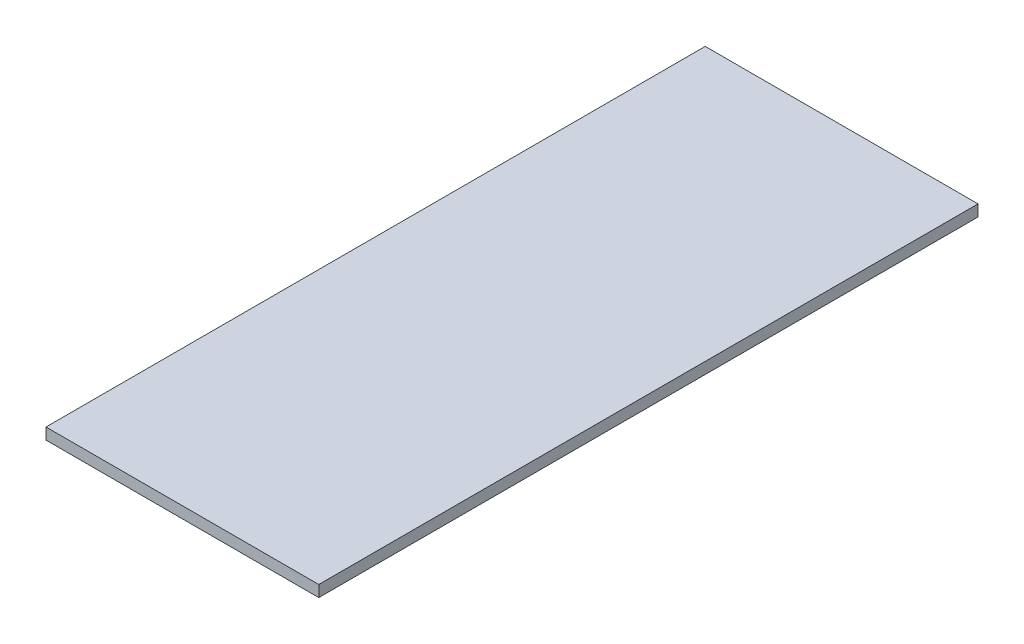
ISO-10303-21;
HEADER;
FILE_DESCRIPTION(('STEP AP214'),'2;1');
FILE_NAME('part.step','',(''),(''),'','','');
FILE_SCHEMA(('AUTOMOTIVE_DESIGN { 1 0 10303 214 1 1 1 1 }'));
ENDSEC;
DATA;
#1=APPLICATION_CONTEXT('core data for automotive mechanical design processes');
#2=APPLICATION_PROTOCOL_DEFINITION('international standard','automotive_design',2000,#1);
#3=PRODUCT_CONTEXT('',#1,'mechanical');
#4=PRODUCT('Part','Part','',(#3));
#5=PRODUCT_RELATED_PRODUCT_CATEGORY('part','',(#4));
#6=PRODUCT_DEFINITION_FORMATION('','',#4);
#7=PRODUCT_DEFINITION_CONTEXT('part definition',#1,'design');
#8=PRODUCT_DEFINITION('design','',#6,#7);
#9=PRODUCT_DEFINITION_SHAPE('','',#8);
#10=(LENGTH_UNIT() NAMED_UNIT(*) SI_UNIT(.MILLI.,.METRE.));
#11=(NAMED_UNIT(*) PLANE_ANGLE_UNIT() SI_UNIT($,.RADIAN.));
#12=(NAMED_UNIT(*) SI_UNIT($,.STERADIAN.) SOLID_ANGLE_UNIT());
#13=UNCERTAINTY_MEASURE_WITH_UNIT(LENGTH_MEASURE(1.E-05),#10,'distance_accuracy_value','');
#14=(GEOMETRIC_REPRESENTATION_CONTEXT(3) GLOBAL_UNCERTAINTY_ASSIGNED_CONTEXT((#13)) GLOBAL_UNIT_ASSIGNED_CONTEXT((#10,
#11,#12)) REPRESENTATION_CONTEXT('',''));
#15=CARTESIAN_POINT('',(0.,0.,0.));
#16=DIRECTION('',(0.,0.,1.));
#17=DIRECTION('',(1.,0.,0.));
#18=AXIS2_PLACEMENT_3D('',#15,#16,#17);
#19=CARTESIAN_POINT('',(60.0000000000001,5.,145.));
#20=DIRECTION('',(-1.,0.,0.));
#21=DIRECTION('',(0.,0.,1.));
#22=AXIS2_PLACEMENT_3D('',#19,#20,#21);
#23=PLANE('',#22);
#24=DIRECTION('',(0.,0.,-1.));
#25=VECTOR('',#24,1.);
#26=CARTESIAN_POINT('',(60.0000000000001,0.,145.));
#27=LINE('',#26,#25);
#28=CARTESIAN_POINT('',(60.0000000000001,0.,145.));
#29=VERTEX_POINT('',#28);
#30=CARTESIAN_POINT('',(60.0000000000001,0.,-145.));
#31=VERTEX_POINT('',#30);
#32=EDGE_CURVE('E96',#29,#31,#27,.T.);
#33=ORIENTED_EDGE('',*,*,#32,.T.);
#34=DIRECTION('',(0.,-1.,0.));
#35=VECTOR('',#34,1.);
#36=CARTESIAN_POINT('',(60.0000000000001,5.,-145.));
#37=LINE('',#36,#35);
#38=CARTESIAN_POINT('',(60.0000000000001,5.,-145.));
#39=VERTEX_POINT('',#38);
#40=EDGE_CURVE('E11',#39,#31,#37,.T.);
#41=ORIENTED_EDGE('',*,*,#40,.F.);
#42=DIRECTION('',(0.,0.,-1.));
#43=VECTOR('',#42,1.);
#44=CARTESIAN_POINT('',(60.0000000000001,5.,145.));
#45=LINE('',#44,#43);
#46=CARTESIAN_POINT('',(60.0000000000001,5.,145.));
#47=VERTEX_POINT('',#46);
#48=EDGE_CURVE('E84',#47,#39,#45,.T.);
#49=ORIENTED_EDGE('',*,*,#48,.F.);
#50=DIRECTION('',(0.,-1.,0.));
#51=VECTOR('',#50,1.);
#52=CARTESIAN_POINT('',(60.0000000000001,5.,145.));
#53=LINE('',#52,#51);
#54=EDGE_CURVE('E92',#47,#29,#53,.T.);
#55=ORIENTED_EDGE('',*,*,#54,.T.);
#56=EDGE_LOOP('',(#33,#41,#49,#55));
#57=FACE_BOUND('',#56,.T.);
#58=ADVANCED_FACE('F33',(#57),#23,.F.);
#59=CARTESIAN_POINT('',(-59.9999999999999,5.,-145.));
#60=DIRECTION('',(0.,0.,1.));
#61=DIRECTION('',(1.,0.,0.));
#62=AXIS2_PLACEMENT_3D('',#59,#60,#61);
#63=PLANE('',#62);
#64=DIRECTION('',(-1.,0.,0.));
#65=VECTOR('',#64,1.);
#66=CARTESIAN_POINT('',(-59.9999999999999,0.,-145.));
#67=LINE('',#66,#65);
#68=CARTESIAN_POINT('',(-59.9999999999999,0.,-145.));
#69=VERTEX_POINT('',#68);
#70=EDGE_CURVE('E88',#31,#69,#67,.T.);
#71=ORIENTED_EDGE('',*,*,#70,.T.);
#72=DIRECTION('',(0.,-1.,0.));
#73=VECTOR('',#72,1.);
#74=CARTESIAN_POINT('',(-59.9999999999999,5.,-145.));
#75=LINE('',#74,#73);
#76=CARTESIAN_POINT('',(-59.9999999999999,5.,-145.));
#77=VERTEX_POINT('',#76);
#78=EDGE_CURVE('E41',#77,#69,#75,.T.);
#79=ORIENTED_EDGE('',*,*,#78,.F.);
#80=DIRECTION('',(-1.,0.,0.));
#81=VECTOR('',#80,1.);
#82=CARTESIAN_POINT('',(-59.9999999999999,5.,-145.));
#83=LINE('',#82,#81);
#84=EDGE_CURVE('E79',#39,#77,#83,.T.);
#85=ORIENTED_EDGE('',*,*,#84,.F.);
#86=ORIENTED_EDGE('',*,*,#40,.T.);
#87=EDGE_LOOP('',(#71,#79,#85,#86));
#88=FACE_BOUND('',#87,.T.);
#89=ADVANCED_FACE('F87',(#88),#63,.F.);
#90=CARTESIAN_POINT('',(-59.9999999999999,5.,145.));
#91=DIRECTION('',(1.,0.,0.));
#92=DIRECTION('',(0.,0.,-1.));
#93=AXIS2_PLACEMENT_3D('',#90,#91,#92);
#94=PLANE('',#93);
#95=DIRECTION('',(0.,0.,1.));
#96=VECTOR('',#95,1.);
#97=CARTESIAN_POINT('',(-59.9999999999999,0.,145.));
#98=LINE('',#97,#96);
#99=CARTESIAN_POINT('',(-59.9999999999999,0.,145.));
#100=VERTEX_POINT('',#99);
#101=EDGE_CURVE('E66',#69,#100,#98,.T.);
#102=ORIENTED_EDGE('',*,*,#101,.T.);
#103=DIRECTION('',(0.,-1.,0.));
#104=VECTOR('',#103,1.);
#105=CARTESIAN_POINT('',(-59.9999999999999,5.,145.));
#106=LINE('',#105,#104);
#107=CARTESIAN_POINT('',(-59.9999999999999,5.,145.));
#108=VERTEX_POINT('',#107);
#109=EDGE_CURVE('E89',#108,#100,#106,.T.);
#110=ORIENTED_EDGE('',*,*,#109,.F.);
#111=DIRECTION('',(0.,0.,1.));
#112=VECTOR('',#111,1.);
#113=CARTESIAN_POINT('',(-59.9999999999999,5.,145.));
#114=LINE('',#113,#112);
#115=EDGE_CURVE('E82',#77,#108,#114,.T.);
#116=ORIENTED_EDGE('',*,*,#115,.F.);
#117=ORIENTED_EDGE('',*,*,#78,.T.);
#118=EDGE_LOOP('',(#102,#110,#116,#117));
#119=FACE_BOUND('',#118,.T.);
#120=ADVANCED_FACE('F90',(#119),#94,.F.);
#121=CARTESIAN_POINT('',(-59.9999999999999,5.,145.));
#122=DIRECTION('',(0.,0.,-1.));
#123=DIRECTION('',(-1.,0.,0.));
#124=AXIS2_PLACEMENT_3D('',#121,#122,#123);
#125=PLANE('',#124);
#126=DIRECTION('',(1.,0.,0.));
#127=VECTOR('',#126,1.);
#128=CARTESIAN_POINT('',(-59.9999999999999,0.,145.));
#129=LINE('',#128,#127);
#130=EDGE_CURVE('E72',#100,#29,#129,.T.);
#131=ORIENTED_EDGE('',*,*,#130,.T.);
#132=ORIENTED_EDGE('',*,*,#54,.F.);
#133=DIRECTION('',(1.,0.,0.));
#134=VECTOR('',#133,1.);
#135=CARTESIAN_POINT('',(-59.9999999999999,5.,145.));
#136=LINE('',#135,#134);
#137=EDGE_CURVE('E49',#108,#47,#136,.T.);
#138=ORIENTED_EDGE('',*,*,#137,.F.);
#139=ORIENTED_EDGE('',*,*,#109,.T.);
#140=EDGE_LOOP('',(#131,#132,#138,#139));
#141=FACE_BOUND('',#140,.T.);
#142=ADVANCED_FACE('F103',(#141),#125,.F.);
#143=CARTESIAN_POINT('',(0.,5.,0.));
#144=DIRECTION('',(0.,-1.,0.));
#145=DIRECTION('',(0.,0.,-1.));
#146=AXIS2_PLACEMENT_3D('',#143,#144,#145);
#147=PLANE('',#146);
#148=ORIENTED_EDGE('',*,*,#48,.T.);
#149=ORIENTED_EDGE('',*,*,#84,.T.);
#150=ORIENTED_EDGE('',*,*,#115,.T.);
#151=ORIENTED_EDGE('',*,*,#137,.T.);
#152=EDGE_LOOP('',(#148,#149,#150,#151));
#153=FACE_BOUND('',#152,.T.);
#154=ADVANCED_FACE('F80',(#153),#147,.F.);
#155=CARTESIAN_POINT('',(0.,0.,0.));
#156=DIRECTION('',(0.,-1.,0.));
#157=DIRECTION('',(0.,0.,-1.));
#158=AXIS2_PLACEMENT_3D('',#155,#156,#157);
#159=PLANE('',#158);
#160=ORIENTED_EDGE('',*,*,#32,.F.);
#161=ORIENTED_EDGE('',*,*,#130,.F.);
#162=ORIENTED_EDGE('',*,*,#101,.F.);
#163=ORIENTED_EDGE('',*,*,#70,.F.);
#164=EDGE_LOOP('',(#160,#161,#162,#163));
#165=FACE_BOUND('',#164,.T.);
#166=ADVANCED_FACE('F106',(#165),#159,.T.);
#167=CLOSED_SHELL('',(#58,#89,#120,#142,#154,#166));
#168=MANIFOLD_SOLID_BREP('B2',#167);
#169=ADVANCED_BREP_SHAPE_REPRESENTATION('',(#18,#168),#14);
#170=SHAPE_DEFINITION_REPRESENTATION(#9,#169);
ENDSEC;
END-ISO-10303-21;
